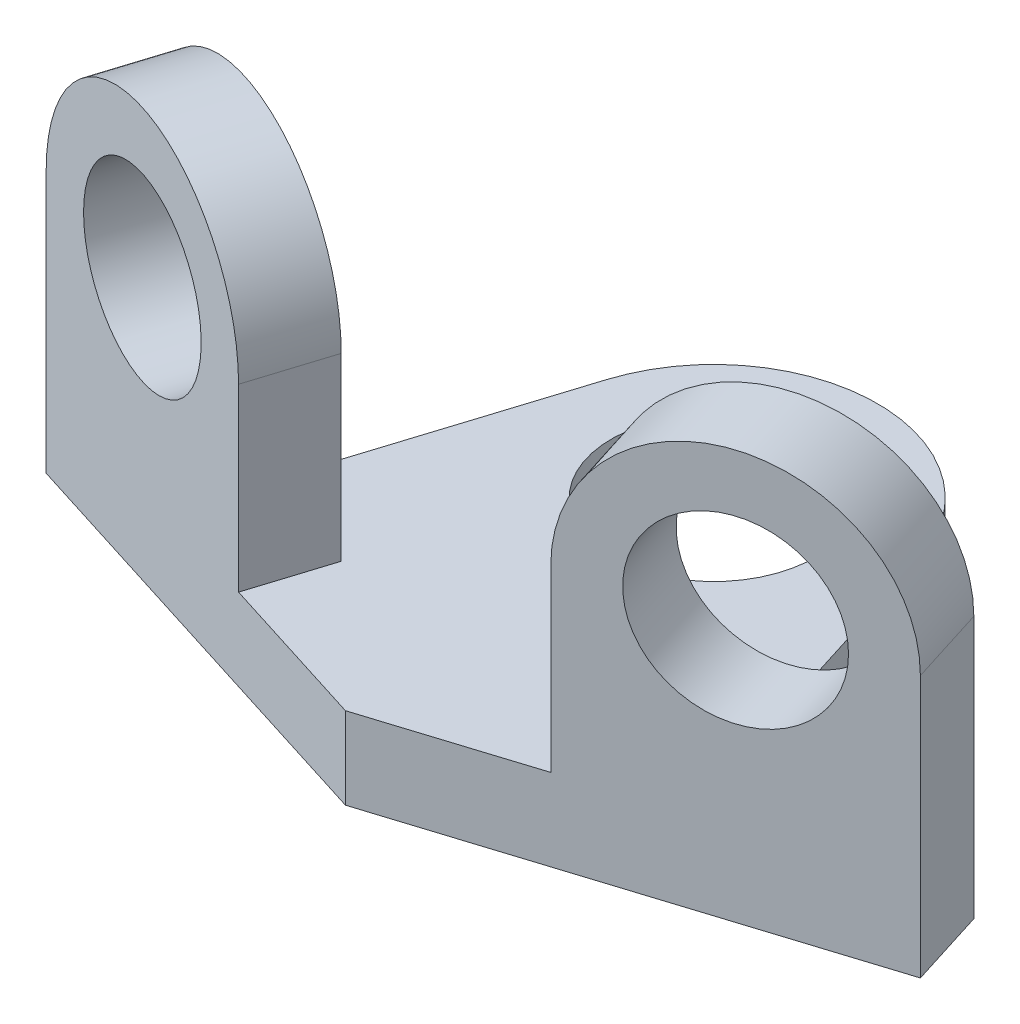
ISO-10303-21;
HEADER;
FILE_DESCRIPTION(('STEP AP214'),'2;1');
FILE_NAME('part.step','',(''),(''),'','','');
FILE_SCHEMA(('AUTOMOTIVE_DESIGN { 1 0 10303 214 1 1 1 1 }'));
ENDSEC;
DATA;
#1=APPLICATION_CONTEXT('core data for automotive mechanical design processes');
#2=APPLICATION_PROTOCOL_DEFINITION('international standard','automotive_design',2000,#1);
#3=PRODUCT_CONTEXT('',#1,'mechanical');
#4=PRODUCT('Part','Part','',(#3));
#5=PRODUCT_RELATED_PRODUCT_CATEGORY('part','',(#4));
#6=PRODUCT_DEFINITION_FORMATION('','',#4);
#7=PRODUCT_DEFINITION_CONTEXT('part definition',#1,'design');
#8=PRODUCT_DEFINITION('design','',#6,#7);
#9=PRODUCT_DEFINITION_SHAPE('','',#8);
#10=(LENGTH_UNIT() NAMED_UNIT(*) SI_UNIT(.MILLI.,.METRE.));
#11=(NAMED_UNIT(*) PLANE_ANGLE_UNIT() SI_UNIT($,.RADIAN.));
#12=(NAMED_UNIT(*) SI_UNIT($,.STERADIAN.) SOLID_ANGLE_UNIT());
#13=UNCERTAINTY_MEASURE_WITH_UNIT(LENGTH_MEASURE(1.E-05),#10,'distance_accuracy_value','');
#14=(GEOMETRIC_REPRESENTATION_CONTEXT(3) GLOBAL_UNCERTAINTY_ASSIGNED_CONTEXT((#13)) GLOBAL_UNIT_ASSIGNED_CONTEXT((#10,
#11,#12)) REPRESENTATION_CONTEXT('',''));
#15=CARTESIAN_POINT('',(0.,0.,0.));
#16=DIRECTION('',(0.,0.,1.));
#17=DIRECTION('',(1.,0.,0.));
#18=AXIS2_PLACEMENT_3D('',#15,#16,#17);
#19=CARTESIAN_POINT('',(0.,10.,-45.));
#20=DIRECTION('',(0.,1.,0.));
#21=DIRECTION('',(0.,0.,1.));
#22=AXIS2_PLACEMENT_3D('',#19,#20,#21);
#23=PLANE('',#22);
#24=CARTESIAN_POINT('',(0.,10.,-45.));
#25=DIRECTION('',(0.,1.,0.));
#26=DIRECTION('',(0.,0.,1.));
#27=AXIS2_PLACEMENT_3D('',#24,#25,#26);
#28=CIRCLE('',#27,12.5);
#29=CARTESIAN_POINT('',(0.,10.,-32.5));
#30=VERTEX_POINT('',#29);
#31=EDGE_CURVE('E251',#30,#30,#28,.T.);
#32=ORIENTED_EDGE('',*,*,#31,.F.);
#33=EDGE_LOOP('',(#32));
#34=FACE_BOUND('',#33,.T.);
#35=DIRECTION('',(-0.300705799504274,0.,0.953716950748227));
#36=VECTOR('',#35,1.);
#37=CARTESIAN_POINT('',(-19.0743390149645,10.,-51.0141159900855));
#38=LINE('',#37,#36);
#39=CARTESIAN_POINT('',(-19.0743390149645,10.,-51.0141159900855));
#40=VERTEX_POINT('',#39);
#41=CARTESIAN_POINT('',(-28.9727508378203,10.,-19.6203645010655));
#42=VERTEX_POINT('',#41);
#43=EDGE_CURVE('E263',#40,#42,#38,.T.);
#44=ORIENTED_EDGE('',*,*,#43,.T.);
#45=DIRECTION('',(0.953716950748226,0.,0.300705799504277));
#46=VECTOR('',#45,1.);
#47=CARTESIAN_POINT('',(-9.89841182285592,10.,-13.6062485109801));
#48=LINE('',#47,#46);
#49=CARTESIAN_POINT('',(-16.0672810199217,10.,-15.5512854975678));
#50=VERTEX_POINT('',#49);
#51=EDGE_CURVE('E61',#42,#50,#48,.T.);
#52=ORIENTED_EDGE('',*,*,#51,.T.);
#53=DIRECTION('',(-0.300705799504277,0.,0.953716950748226));
#54=VECTOR('',#53,1.);
#55=CARTESIAN_POINT('',(-6.16886919706581,10.,-46.9450369865877));
#56=LINE('',#55,#54);
#57=CARTESIAN_POINT('',(-19.0743390149645,10.,-6.01411599008554));
#58=VERTEX_POINT('',#57);
#59=EDGE_CURVE('E191',#50,#58,#56,.T.);
#60=ORIENTED_EDGE('',*,*,#59,.T.);
#61=DIRECTION('',(0.953716950748225,0.,0.300705799504277));
#62=VECTOR('',#61,1.);
#63=CARTESIAN_POINT('',(0.,10.,0.));
#64=LINE('',#63,#62);
#65=CARTESIAN_POINT('',(0.,10.,0.));
#66=VERTEX_POINT('',#65);
#67=EDGE_CURVE('E267',#58,#66,#64,.T.);
#68=ORIENTED_EDGE('',*,*,#67,.T.);
#69=DIRECTION('',(0.953716950748225,0.,-0.300705799504277));
#70=VECTOR('',#69,1.);
#71=CARTESIAN_POINT('',(0.,10.,0.));
#72=LINE('',#71,#70);
#73=CARTESIAN_POINT('',(19.0743390149645,10.,-6.01411599008554));
#74=VERTEX_POINT('',#73);
#75=EDGE_CURVE('E270',#66,#74,#72,.T.);
#76=ORIENTED_EDGE('',*,*,#75,.T.);
#77=DIRECTION('',(0.300705799504277,0.,0.953716950748226));
#78=VECTOR('',#77,1.);
#79=CARTESIAN_POINT('',(6.16886919706581,10.,-46.9450369865877));
#80=LINE('',#79,#78);
#81=CARTESIAN_POINT('',(16.0672810199217,10.,-15.5512854975678));
#82=VERTEX_POINT('',#81);
#83=EDGE_CURVE('E246',#82,#74,#80,.T.);
#84=ORIENTED_EDGE('',*,*,#83,.F.);
#85=DIRECTION('',(0.953716950748226,0.,-0.300705799504277));
#86=VECTOR('',#85,1.);
#87=CARTESIAN_POINT('',(9.89841182285592,10.,-13.6062485109801));
#88=LINE('',#87,#86);
#89=CARTESIAN_POINT('',(28.9727508378203,10.,-19.6203645010655));
#90=VERTEX_POINT('',#89);
#91=EDGE_CURVE('E237',#82,#90,#88,.T.);
#92=ORIENTED_EDGE('',*,*,#91,.T.);
#93=DIRECTION('',(-0.300705799504274,0.,-0.953716950748227));
#94=VECTOR('',#93,1.);
#95=CARTESIAN_POINT('',(19.0743390149645,10.,-51.0141159900855));
#96=LINE('',#95,#94);
#97=CARTESIAN_POINT('',(19.0743390149645,10.,-51.0141159900855));
#98=VERTEX_POINT('',#97);
#99=EDGE_CURVE('E273',#90,#98,#96,.T.);
#100=ORIENTED_EDGE('',*,*,#99,.T.);
#101=CARTESIAN_POINT('',(0.,10.,-45.));
#102=DIRECTION('',(0.,1.,0.));
#103=DIRECTION('',(0.,0.,1.));
#104=AXIS2_PLACEMENT_3D('',#101,#102,#103);
#105=CIRCLE('',#104,20.);
#106=EDGE_CURVE('E259',#98,#40,#105,.T.);
#107=ORIENTED_EDGE('',*,*,#106,.T.);
#108=EDGE_LOOP('',(#44,#52,#60,#68,#76,#84,#92,#100,#107));
#109=FACE_BOUND('',#108,.T.);
#110=ADVANCED_FACE('F45',(#34,#109),#23,.T.);
#111=CARTESIAN_POINT('',(-19.0743390149645,10.,-51.0141159900855));
#112=DIRECTION('',(0.953716950748227,0.,0.300705799504274));
#113=DIRECTION('',(0.300705799504274,0.,-0.953716950748227));
#114=AXIS2_PLACEMENT_3D('',#111,#112,#113);
#115=PLANE('',#114);
#116=DIRECTION('',(0.,-1.,0.));
#117=VECTOR('',#116,1.);
#118=CARTESIAN_POINT('',(-28.9727508378203,10.,-19.6203645010656));
#119=LINE('',#118,#117);
#120=CARTESIAN_POINT('',(-28.9727508378203,0.,-19.6203645010656));
#121=VERTEX_POINT('',#120);
#122=EDGE_CURVE('E11',#42,#121,#119,.T.);
#123=ORIENTED_EDGE('',*,*,#122,.F.);
#124=ORIENTED_EDGE('',*,*,#43,.F.);
#125=DIRECTION('',(0.,-1.,0.));
#126=VECTOR('',#125,1.);
#127=CARTESIAN_POINT('',(-19.0743390149645,10.,-51.0141159900855));
#128=LINE('',#127,#126);
#129=CARTESIAN_POINT('',(-19.0743390149645,0.,-51.0141159900855));
#130=VERTEX_POINT('',#129);
#131=EDGE_CURVE('E298',#40,#130,#128,.T.);
#132=ORIENTED_EDGE('',*,*,#131,.T.);
#133=DIRECTION('',(-0.300705799504274,0.,0.953716950748227));
#134=VECTOR('',#133,1.);
#135=CARTESIAN_POINT('',(-19.0743390149645,0.,-51.0141159900855));
#136=LINE('',#135,#134);
#137=EDGE_CURVE('E280',#130,#121,#136,.T.);
#138=ORIENTED_EDGE('',*,*,#137,.T.);
#139=EDGE_LOOP('',(#123,#124,#132,#138));
#140=FACE_BOUND('',#139,.T.);
#141=ADVANCED_FACE('F356',(#140),#115,.F.);
#142=CARTESIAN_POINT('',(19.0743390149645,10.,-51.0141159900855));
#143=DIRECTION('',(-0.953716950748227,0.,0.300705799504274));
#144=DIRECTION('',(0.300705799504274,0.,0.953716950748227));
#145=AXIS2_PLACEMENT_3D('',#142,#143,#144);
#146=PLANE('',#145);
#147=DIRECTION('',(0.,1.,0.));
#148=VECTOR('',#147,1.);
#149=CARTESIAN_POINT('',(28.9727508378203,10.,-19.6203645010656));
#150=LINE('',#149,#148);
#151=CARTESIAN_POINT('',(28.9727508378203,0.,-19.6203645010655));
#152=VERTEX_POINT('',#151);
#153=EDGE_CURVE('E54',#152,#90,#150,.T.);
#154=ORIENTED_EDGE('',*,*,#153,.F.);
#155=DIRECTION('',(-0.300705799504274,0.,-0.953716950748227));
#156=VECTOR('',#155,1.);
#157=CARTESIAN_POINT('',(19.0743390149645,0.,-51.0141159900855));
#158=LINE('',#157,#156);
#159=CARTESIAN_POINT('',(19.0743390149645,0.,-51.0141159900855));
#160=VERTEX_POINT('',#159);
#161=EDGE_CURVE('E264',#152,#160,#158,.T.);
#162=ORIENTED_EDGE('',*,*,#161,.T.);
#163=DIRECTION('',(0.,-1.,0.));
#164=VECTOR('',#163,1.);
#165=CARTESIAN_POINT('',(19.0743390149645,10.,-51.0141159900855));
#166=LINE('',#165,#164);
#167=EDGE_CURVE('E276',#98,#160,#166,.T.);
#168=ORIENTED_EDGE('',*,*,#167,.F.);
#169=ORIENTED_EDGE('',*,*,#99,.F.);
#170=EDGE_LOOP('',(#154,#162,#168,#169));
#171=FACE_BOUND('',#170,.T.);
#172=ADVANCED_FACE('F313',(#171),#146,.F.);
#173=CARTESIAN_POINT('',(0.,0.,-45.));
#174=DIRECTION('',(0.,1.,0.));
#175=DIRECTION('',(0.,0.,1.));
#176=AXIS2_PLACEMENT_3D('',#173,#174,#175);
#177=PLANE('',#176);
#178=DIRECTION('',(0.953716950748225,0.,0.300705799504277));
#179=VECTOR('',#178,1.);
#180=CARTESIAN_POINT('',(0.,0.,0.));
#181=LINE('',#180,#179);
#182=CARTESIAN_POINT('',(-53.4081492419006,0.,-16.8395247722395));
#183=VERTEX_POINT('',#182);
#184=CARTESIAN_POINT('',(0.,0.,0.));
#185=VERTEX_POINT('',#184);
#186=EDGE_CURVE('E283',#183,#185,#181,.T.);
#187=ORIENTED_EDGE('',*,*,#186,.F.);
#188=DIRECTION('',(-0.300705799504277,0.,0.953716950748226));
#189=VECTOR('',#188,1.);
#190=CARTESIAN_POINT('',(-50.4010912468579,0.,-26.3766942797218));
#191=LINE('',#190,#189);
#192=CARTESIAN_POINT('',(-50.4010912468579,0.,-26.3766942797218));
#193=VERTEX_POINT('',#192);
#194=EDGE_CURVE('E163',#193,#183,#191,.T.);
#195=ORIENTED_EDGE('',*,*,#194,.F.);
#196=DIRECTION('',(-0.953716950748226,0.,-0.300705799504277));
#197=VECTOR('',#196,1.);
#198=CARTESIAN_POINT('',(-16.0672810199217,0.,-15.5512854975678));
#199=LINE('',#198,#197);
#200=EDGE_CURVE('E148',#121,#193,#199,.T.);
#201=ORIENTED_EDGE('',*,*,#200,.F.);
#202=ORIENTED_EDGE('',*,*,#137,.F.);
#203=CARTESIAN_POINT('',(0.,0.,-45.));
#204=DIRECTION('',(0.,1.,0.));
#205=DIRECTION('',(0.,0.,1.));
#206=AXIS2_PLACEMENT_3D('',#203,#204,#205);
#207=CIRCLE('',#206,20.);
#208=EDGE_CURVE('E255',#160,#130,#207,.T.);
#209=ORIENTED_EDGE('',*,*,#208,.F.);
#210=ORIENTED_EDGE('',*,*,#161,.F.);
#211=DIRECTION('',(0.953716950748226,0.,-0.300705799504277));
#212=VECTOR('',#211,1.);
#213=CARTESIAN_POINT('',(16.0672810199217,0.,-15.5512854975678));
#214=LINE('',#213,#212);
#215=CARTESIAN_POINT('',(50.4010912468579,0.,-26.3766942797218));
#216=VERTEX_POINT('',#215);
#217=EDGE_CURVE('E216',#152,#216,#214,.T.);
#218=ORIENTED_EDGE('',*,*,#217,.T.);
#219=DIRECTION('',(0.300705799504277,0.,0.953716950748226));
#220=VECTOR('',#219,1.);
#221=CARTESIAN_POINT('',(50.4010912468579,0.,-26.3766942797218));
#222=LINE('',#221,#220);
#223=CARTESIAN_POINT('',(53.4081492419006,0.,-16.8395247722395));
#224=VERTEX_POINT('',#223);
#225=EDGE_CURVE('E238',#216,#224,#222,.T.);
#226=ORIENTED_EDGE('',*,*,#225,.T.);
#227=DIRECTION('',(0.953716950748225,0.,-0.300705799504277));
#228=VECTOR('',#227,1.);
#229=CARTESIAN_POINT('',(0.,0.,0.));
#230=LINE('',#229,#228);
#231=EDGE_CURVE('E286',#185,#224,#230,.T.);
#232=ORIENTED_EDGE('',*,*,#231,.F.);
#233=EDGE_LOOP('',(#187,#195,#201,#202,#209,#210,#218,#226,#232));
#234=FACE_BOUND('',#233,.T.);
#235=CARTESIAN_POINT('',(0.,0.,-45.));
#236=DIRECTION('',(0.,1.,0.));
#237=DIRECTION('',(0.,0.,1.));
#238=AXIS2_PLACEMENT_3D('',#235,#236,#237);
#239=CIRCLE('',#238,12.5);
#240=CARTESIAN_POINT('',(0.,0.,-32.5));
#241=VERTEX_POINT('',#240);
#242=EDGE_CURVE('E250',#241,#241,#239,.T.);
#243=ORIENTED_EDGE('',*,*,#242,.T.);
#244=EDGE_LOOP('',(#243));
#245=FACE_BOUND('',#244,.T.);
#246=ADVANCED_FACE('F317',(#234,#245),#177,.F.);
#247=CARTESIAN_POINT('',(0.,10.,-45.));
#248=DIRECTION('',(0.,-1.,0.));
#249=DIRECTION('',(0.,0.,-1.));
#250=AXIS2_PLACEMENT_3D('',#247,#248,#249);
#251=CYLINDRICAL_SURFACE('',#250,20.);
#252=ORIENTED_EDGE('',*,*,#208,.T.);
#253=ORIENTED_EDGE('',*,*,#131,.F.);
#254=ORIENTED_EDGE('',*,*,#106,.F.);
#255=ORIENTED_EDGE('',*,*,#167,.T.);
#256=EDGE_LOOP('',(#252,#253,#254,#255));
#257=FACE_BOUND('',#256,.T.);
#258=ADVANCED_FACE('F47',(#257),#251,.T.);
#259=CARTESIAN_POINT('',(0.,10.,0.));
#260=DIRECTION('',(0.300705799504277,0.,-0.953716950748226));
#261=DIRECTION('',(-0.953716950748226,0.,-0.300705799504277));
#262=AXIS2_PLACEMENT_3D('',#259,#260,#261);
#263=PLANE('',#262);
#264=ORIENTED_EDGE('',*,*,#67,.F.);
#265=DIRECTION('',(0.,-1.,0.));
#266=VECTOR('',#265,1.);
#267=CARTESIAN_POINT('',(-19.0743390149645,32.,-6.01411599008554));
#268=LINE('',#267,#266);
#269=CARTESIAN_POINT('',(-19.0743390149645,32.,-6.01411599008554));
#270=VERTEX_POINT('',#269);
#271=EDGE_CURVE('E170',#270,#58,#268,.T.);
#272=ORIENTED_EDGE('',*,*,#271,.F.);
#273=CARTESIAN_POINT('',(-36.2412441284326,32.,-11.4268203811625));
#274=DIRECTION('',(0.300705799504277,0.,-0.953716950748226));
#275=DIRECTION('',(-0.953716950748226,0.,-0.300705799504277));
#276=AXIS2_PLACEMENT_3D('',#273,#274,#275);
#277=CIRCLE('',#276,18.);
#278=CARTESIAN_POINT('',(-53.4081492419006,32.,-16.8395247722395));
#279=VERTEX_POINT('',#278);
#280=EDGE_CURVE('E183',#279,#270,#277,.T.);
#281=ORIENTED_EDGE('',*,*,#280,.F.);
#282=DIRECTION('',(0.,1.,0.));
#283=VECTOR('',#282,1.);
#284=CARTESIAN_POINT('',(-53.4081492419006,32.,-16.8395247722395));
#285=LINE('',#284,#283);
#286=EDGE_CURVE('E158',#183,#279,#285,.T.);
#287=ORIENTED_EDGE('',*,*,#286,.F.);
#288=ORIENTED_EDGE('',*,*,#186,.T.);
#289=DIRECTION('',(0.,-1.,0.));
#290=VECTOR('',#289,1.);
#291=CARTESIAN_POINT('',(0.,10.,0.));
#292=LINE('',#291,#290);
#293=EDGE_CURVE('E294',#66,#185,#292,.T.);
#294=ORIENTED_EDGE('',*,*,#293,.F.);
#295=EDGE_LOOP('',(#264,#272,#281,#287,#288,#294));
#296=FACE_BOUND('',#295,.T.);
#297=CARTESIAN_POINT('',(-36.2412441284326,32.,-11.4268203811625));
#298=DIRECTION('',(0.300705799504277,0.,-0.953716950748226));
#299=DIRECTION('',(-0.953716950748226,0.,-0.300705799504277));
#300=AXIS2_PLACEMENT_3D('',#297,#298,#299);
#301=CIRCLE('',#300,11.);
#302=CARTESIAN_POINT('',(-46.732130586663,32.,-14.7345841757096));
#303=VERTEX_POINT('',#302);
#304=EDGE_CURVE('E176',#303,#303,#301,.T.);
#305=ORIENTED_EDGE('',*,*,#304,.T.);
#306=EDGE_LOOP('',(#305));
#307=FACE_BOUND('',#306,.T.);
#308=ADVANCED_FACE('F341',(#296,#307),#263,.F.);
#309=CARTESIAN_POINT('',(0.,10.,0.));
#310=DIRECTION('',(-0.300705799504277,0.,-0.953716950748226));
#311=DIRECTION('',(-0.953716950748226,0.,0.300705799504277));
#312=AXIS2_PLACEMENT_3D('',#309,#310,#311);
#313=PLANE('',#312);
#314=ORIENTED_EDGE('',*,*,#231,.T.);
#315=DIRECTION('',(0.,1.,0.));
#316=VECTOR('',#315,1.);
#317=CARTESIAN_POINT('',(53.4081492419006,32.,-16.8395247722395));
#318=LINE('',#317,#316);
#319=CARTESIAN_POINT('',(53.4081492419006,32.,-16.8395247722395));
#320=VERTEX_POINT('',#319);
#321=EDGE_CURVE('E212',#224,#320,#318,.T.);
#322=ORIENTED_EDGE('',*,*,#321,.T.);
#323=CARTESIAN_POINT('',(36.2412441284326,32.,-11.4268203811625));
#324=DIRECTION('',(0.300705799504277,0.,0.953716950748226));
#325=DIRECTION('',(0.953716950748226,0.,-0.300705799504277));
#326=AXIS2_PLACEMENT_3D('',#323,#324,#325);
#327=CIRCLE('',#326,18.);
#328=CARTESIAN_POINT('',(19.0743390149645,32.,-6.01411599008554));
#329=VERTEX_POINT('',#328);
#330=EDGE_CURVE('E203',#320,#329,#327,.T.);
#331=ORIENTED_EDGE('',*,*,#330,.T.);
#332=DIRECTION('',(0.,-1.,0.));
#333=VECTOR('',#332,1.);
#334=CARTESIAN_POINT('',(19.0743390149645,32.,-6.01411599008554));
#335=LINE('',#334,#333);
#336=EDGE_CURVE('E227',#329,#74,#335,.T.);
#337=ORIENTED_EDGE('',*,*,#336,.T.);
#338=ORIENTED_EDGE('',*,*,#75,.F.);
#339=ORIENTED_EDGE('',*,*,#293,.T.);
#340=EDGE_LOOP('',(#314,#322,#331,#337,#338,#339));
#341=FACE_BOUND('',#340,.T.);
#342=CARTESIAN_POINT('',(36.2412441284326,32.,-11.4268203811625));
#343=DIRECTION('',(0.300705799504277,0.,0.953716950748226));
#344=DIRECTION('',(0.953716950748226,0.,-0.300705799504277));
#345=AXIS2_PLACEMENT_3D('',#342,#343,#344);
#346=CIRCLE('',#345,11.);
#347=CARTESIAN_POINT('',(46.732130586663,32.,-14.7345841757096));
#348=VERTEX_POINT('',#347);
#349=EDGE_CURVE('E198',#348,#348,#346,.T.);
#350=ORIENTED_EDGE('',*,*,#349,.F.);
#351=EDGE_LOOP('',(#350));
#352=FACE_BOUND('',#351,.T.);
#353=ADVANCED_FACE('F328',(#341,#352),#313,.F.);
#354=CARTESIAN_POINT('',(0.,10.,-45.));
#355=DIRECTION('',(0.,-1.,0.));
#356=DIRECTION('',(0.,0.,-1.));
#357=AXIS2_PLACEMENT_3D('',#354,#355,#356);
#358=CYLINDRICAL_SURFACE('',#357,12.5);
#359=ORIENTED_EDGE('',*,*,#31,.T.);
#360=EDGE_LOOP('',(#359));
#361=FACE_BOUND('',#360,.T.);
#362=ORIENTED_EDGE('',*,*,#242,.F.);
#363=EDGE_LOOP('',(#362));
#364=FACE_BOUND('',#363,.T.);
#365=ADVANCED_FACE('F366',(#361,#364),#358,.F.);
#366=CARTESIAN_POINT('',(33.2341861333898,32.,-20.9639898886448));
#367=DIRECTION('',(0.300705799504277,0.,0.953716950748226));
#368=DIRECTION('',(0.953716950748226,0.,-0.300705799504277));
#369=AXIS2_PLACEMENT_3D('',#366,#367,#368);
#370=CYLINDRICAL_SURFACE('',#369,18.);
#371=ORIENTED_EDGE('',*,*,#330,.F.);
#372=DIRECTION('',(0.300705799504277,0.,0.953716950748226));
#373=VECTOR('',#372,1.);
#374=CARTESIAN_POINT('',(50.4010912468578,32.,-26.3766942797218));
#375=LINE('',#374,#373);
#376=CARTESIAN_POINT('',(50.4010912468578,32.,-26.3766942797218));
#377=VERTEX_POINT('',#376);
#378=EDGE_CURVE('E234',#377,#320,#375,.T.);
#379=ORIENTED_EDGE('',*,*,#378,.F.);
#380=CARTESIAN_POINT('',(33.2341861333898,32.,-20.9639898886448));
#381=DIRECTION('',(0.300705799504277,0.,0.953716950748226));
#382=DIRECTION('',(0.953716950748226,0.,-0.300705799504277));
#383=AXIS2_PLACEMENT_3D('',#380,#381,#382);
#384=CIRCLE('',#383,18.);
#385=CARTESIAN_POINT('',(16.0672810199217,32.,-15.5512854975678));
#386=VERTEX_POINT('',#385);
#387=EDGE_CURVE('E207',#377,#386,#384,.T.);
#388=ORIENTED_EDGE('',*,*,#387,.T.);
#389=DIRECTION('',(0.300705799504277,0.,0.953716950748226));
#390=VECTOR('',#389,1.);
#391=CARTESIAN_POINT('',(16.0672810199217,32.,-15.5512854975678));
#392=LINE('',#391,#390);
#393=EDGE_CURVE('E223',#386,#329,#392,.T.);
#394=ORIENTED_EDGE('',*,*,#393,.T.);
#395=EDGE_LOOP('',(#371,#379,#388,#394));
#396=FACE_BOUND('',#395,.T.);
#397=ADVANCED_FACE('F333',(#396),#370,.T.);
#398=CARTESIAN_POINT('',(50.4010912468578,32.,-26.3766942797218));
#399=DIRECTION('',(0.953716950748226,0.,-0.300705799504277));
#400=DIRECTION('',(-0.300705799504277,0.,-0.953716950748226));
#401=AXIS2_PLACEMENT_3D('',#398,#399,#400);
#402=PLANE('',#401);
#403=ORIENTED_EDGE('',*,*,#321,.F.);
#404=ORIENTED_EDGE('',*,*,#225,.F.);
#405=DIRECTION('',(0.,1.,0.));
#406=VECTOR('',#405,1.);
#407=CARTESIAN_POINT('',(50.4010912468578,32.,-26.3766942797218));
#408=LINE('',#407,#406);
#409=EDGE_CURVE('E219',#216,#377,#408,.T.);
#410=ORIENTED_EDGE('',*,*,#409,.T.);
#411=ORIENTED_EDGE('',*,*,#378,.T.);
#412=EDGE_LOOP('',(#403,#404,#410,#411));
#413=FACE_BOUND('',#412,.T.);
#414=ADVANCED_FACE('F336',(#413),#402,.T.);
#415=CARTESIAN_POINT('',(16.0672810199217,32.,-15.5512854975678));
#416=DIRECTION('',(-0.953716950748226,0.,0.300705799504277));
#417=DIRECTION('',(0.300705799504277,0.,0.953716950748226));
#418=AXIS2_PLACEMENT_3D('',#415,#416,#417);
#419=PLANE('',#418);
#420=DIRECTION('',(0.,-1.,0.));
#421=VECTOR('',#420,1.);
#422=CARTESIAN_POINT('',(16.0672810199217,32.,-15.5512854975678));
#423=LINE('',#422,#421);
#424=EDGE_CURVE('E211',#386,#82,#423,.T.);
#425=ORIENTED_EDGE('',*,*,#424,.T.);
#426=ORIENTED_EDGE('',*,*,#83,.T.);
#427=ORIENTED_EDGE('',*,*,#336,.F.);
#428=ORIENTED_EDGE('',*,*,#393,.F.);
#429=EDGE_LOOP('',(#425,#426,#427,#428));
#430=FACE_BOUND('',#429,.T.);
#431=ADVANCED_FACE('F326',(#430),#419,.T.);
#432=CARTESIAN_POINT('',(33.2341861333898,32.,-20.9639898886448));
#433=DIRECTION('',(0.300705799504277,0.,0.953716950748226));
#434=DIRECTION('',(0.953716950748226,0.,-0.300705799504277));
#435=AXIS2_PLACEMENT_3D('',#432,#433,#434);
#436=PLANE('',#435);
#437=ORIENTED_EDGE('',*,*,#91,.F.);
#438=ORIENTED_EDGE('',*,*,#424,.F.);
#439=ORIENTED_EDGE('',*,*,#387,.F.);
#440=ORIENTED_EDGE('',*,*,#409,.F.);
#441=ORIENTED_EDGE('',*,*,#217,.F.);
#442=ORIENTED_EDGE('',*,*,#153,.T.);
#443=EDGE_LOOP('',(#437,#438,#439,#440,#441,#442));
#444=FACE_BOUND('',#443,.T.);
#445=CARTESIAN_POINT('',(33.2341861333898,32.,-20.9639898886448));
#446=DIRECTION('',(0.300705799504277,0.,0.953716950748226));
#447=DIRECTION('',(0.953716950748226,0.,-0.300705799504277));
#448=AXIS2_PLACEMENT_3D('',#445,#446,#447);
#449=CIRCLE('',#448,11.);
#450=CARTESIAN_POINT('',(43.7250725916203,32.,-24.2717536831918));
#451=VERTEX_POINT('',#450);
#452=EDGE_CURVE('E199',#451,#451,#449,.T.);
#453=ORIENTED_EDGE('',*,*,#452,.T.);
#454=EDGE_LOOP('',(#453));
#455=FACE_BOUND('',#454,.T.);
#456=ADVANCED_FACE('F306',(#444,#455),#436,.F.);
#457=CARTESIAN_POINT('',(33.2341861333898,32.,-20.9639898886448));
#458=DIRECTION('',(0.300705799504277,0.,0.953716950748226));
#459=DIRECTION('',(0.953716950748226,0.,-0.300705799504277));
#460=AXIS2_PLACEMENT_3D('',#457,#458,#459);
#461=CYLINDRICAL_SURFACE('',#460,11.);
#462=ORIENTED_EDGE('',*,*,#452,.F.);
#463=EDGE_LOOP('',(#462));
#464=FACE_BOUND('',#463,.T.);
#465=ORIENTED_EDGE('',*,*,#349,.T.);
#466=EDGE_LOOP('',(#465));
#467=FACE_BOUND('',#466,.T.);
#468=ADVANCED_FACE('F426',(#464,#467),#461,.F.);
#469=CARTESIAN_POINT('',(-33.2341861333898,32.,-20.9639898886448));
#470=DIRECTION('',(-0.300705799504277,0.,0.953716950748226));
#471=DIRECTION('',(-0.953716950748226,0.,-0.300705799504277));
#472=AXIS2_PLACEMENT_3D('',#469,#470,#471);
#473=PLANE('',#472);
#474=ORIENTED_EDGE('',*,*,#51,.F.);
#475=ORIENTED_EDGE('',*,*,#122,.T.);
#476=ORIENTED_EDGE('',*,*,#200,.T.);
#477=DIRECTION('',(0.,1.,0.));
#478=VECTOR('',#477,1.);
#479=CARTESIAN_POINT('',(-50.4010912468578,32.,-26.3766942797218));
#480=LINE('',#479,#478);
#481=CARTESIAN_POINT('',(-50.4010912468578,32.,-26.3766942797218));
#482=VERTEX_POINT('',#481);
#483=EDGE_CURVE('E139',#193,#482,#480,.T.);
#484=ORIENTED_EDGE('',*,*,#483,.T.);
#485=CARTESIAN_POINT('',(-33.2341861333898,32.,-20.9639898886448));
#486=DIRECTION('',(0.300705799504277,0.,-0.953716950748226));
#487=DIRECTION('',(-0.953716950748226,0.,-0.300705799504277));
#488=AXIS2_PLACEMENT_3D('',#485,#486,#487);
#489=CIRCLE('',#488,18.);
#490=CARTESIAN_POINT('',(-16.0672810199217,32.,-15.5512854975678));
#491=VERTEX_POINT('',#490);
#492=EDGE_CURVE('E145',#482,#491,#489,.T.);
#493=ORIENTED_EDGE('',*,*,#492,.T.);
#494=DIRECTION('',(0.,-1.,0.));
#495=VECTOR('',#494,1.);
#496=CARTESIAN_POINT('',(-16.0672810199217,32.,-15.5512854975678));
#497=LINE('',#496,#495);
#498=EDGE_CURVE('E164',#491,#50,#497,.T.);
#499=ORIENTED_EDGE('',*,*,#498,.T.);
#500=EDGE_LOOP('',(#474,#475,#476,#484,#493,#499));
#501=FACE_BOUND('',#500,.T.);
#502=CARTESIAN_POINT('',(-33.2341861333898,32.,-20.9639898886448));
#503=DIRECTION('',(0.300705799504277,0.,-0.953716950748226));
#504=DIRECTION('',(-0.953716950748226,0.,-0.300705799504277));
#505=AXIS2_PLACEMENT_3D('',#502,#503,#504);
#506=CIRCLE('',#505,11.);
#507=CARTESIAN_POINT('',(-43.7250725916203,32.,-24.2717536831918));
#508=VERTEX_POINT('',#507);
#509=EDGE_CURVE('E186',#508,#508,#506,.T.);
#510=ORIENTED_EDGE('',*,*,#509,.F.);
#511=EDGE_LOOP('',(#510));
#512=FACE_BOUND('',#511,.T.);
#513=ADVANCED_FACE('F141',(#501,#512),#473,.F.);
#514=CARTESIAN_POINT('',(-33.2341861333898,32.,-20.9639898886448));
#515=DIRECTION('',(-0.300705799504277,0.,0.953716950748226));
#516=DIRECTION('',(0.953716950748226,0.,0.300705799504277));
#517=AXIS2_PLACEMENT_3D('',#514,#515,#516);
#518=CYLINDRICAL_SURFACE('',#517,18.);
#519=ORIENTED_EDGE('',*,*,#280,.T.);
#520=DIRECTION('',(-0.300705799504277,0.,0.953716950748226));
#521=VECTOR('',#520,1.);
#522=CARTESIAN_POINT('',(-16.0672810199217,32.,-15.5512854975678));
#523=LINE('',#522,#521);
#524=EDGE_CURVE('E168',#491,#270,#523,.T.);
#525=ORIENTED_EDGE('',*,*,#524,.F.);
#526=ORIENTED_EDGE('',*,*,#492,.F.);
#527=DIRECTION('',(-0.300705799504277,0.,0.953716950748226));
#528=VECTOR('',#527,1.);
#529=CARTESIAN_POINT('',(-50.4010912468578,32.,-26.3766942797218));
#530=LINE('',#529,#528);
#531=EDGE_CURVE('E155',#482,#279,#530,.T.);
#532=ORIENTED_EDGE('',*,*,#531,.T.);
#533=EDGE_LOOP('',(#519,#525,#526,#532));
#534=FACE_BOUND('',#533,.T.);
#535=ADVANCED_FACE('F166',(#534),#518,.T.);
#536=CARTESIAN_POINT('',(-16.0672810199217,32.,-15.5512854975678));
#537=DIRECTION('',(-0.953716950748226,0.,-0.300705799504277));
#538=DIRECTION('',(-0.300705799504277,0.,0.953716950748226));
#539=AXIS2_PLACEMENT_3D('',#536,#537,#538);
#540=PLANE('',#539);
#541=ORIENTED_EDGE('',*,*,#59,.F.);
#542=ORIENTED_EDGE('',*,*,#498,.F.);
#543=ORIENTED_EDGE('',*,*,#524,.T.);
#544=ORIENTED_EDGE('',*,*,#271,.T.);
#545=EDGE_LOOP('',(#541,#542,#543,#544));
#546=FACE_BOUND('',#545,.T.);
#547=ADVANCED_FACE('F344',(#546),#540,.F.);
#548=CARTESIAN_POINT('',(-50.4010912468578,32.,-26.3766942797218));
#549=DIRECTION('',(0.953716950748226,0.,0.300705799504277));
#550=DIRECTION('',(0.300705799504277,0.,-0.953716950748226));
#551=AXIS2_PLACEMENT_3D('',#548,#549,#550);
#552=PLANE('',#551);
#553=ORIENTED_EDGE('',*,*,#286,.T.);
#554=ORIENTED_EDGE('',*,*,#531,.F.);
#555=ORIENTED_EDGE('',*,*,#483,.F.);
#556=ORIENTED_EDGE('',*,*,#194,.T.);
#557=EDGE_LOOP('',(#553,#554,#555,#556));
#558=FACE_BOUND('',#557,.T.);
#559=ADVANCED_FACE('F156',(#558),#552,.F.);
#560=CARTESIAN_POINT('',(-33.2341861333898,32.,-20.9639898886448));
#561=DIRECTION('',(-0.300705799504277,0.,0.953716950748226));
#562=DIRECTION('',(0.953716950748226,0.,0.300705799504277));
#563=AXIS2_PLACEMENT_3D('',#560,#561,#562);
#564=CYLINDRICAL_SURFACE('',#563,11.);
#565=ORIENTED_EDGE('',*,*,#509,.T.);
#566=EDGE_LOOP('',(#565));
#567=FACE_BOUND('',#566,.T.);
#568=ORIENTED_EDGE('',*,*,#304,.F.);
#569=EDGE_LOOP('',(#568));
#570=FACE_BOUND('',#569,.T.);
#571=ADVANCED_FACE('F351',(#567,#570),#564,.F.);
#572=CLOSED_SHELL('',(#110,#141,#172,#246,#258,#308,#353,#365,#397,#414,#431,#456,#468,#513,
#535,#547,#559,#571));
#573=MANIFOLD_SOLID_BREP('B2',#572);
#574=ADVANCED_BREP_SHAPE_REPRESENTATION('',(#18,#573),#14);
#575=SHAPE_DEFINITION_REPRESENTATION(#9,#574);
ENDSEC;
END-ISO-10303-21;
